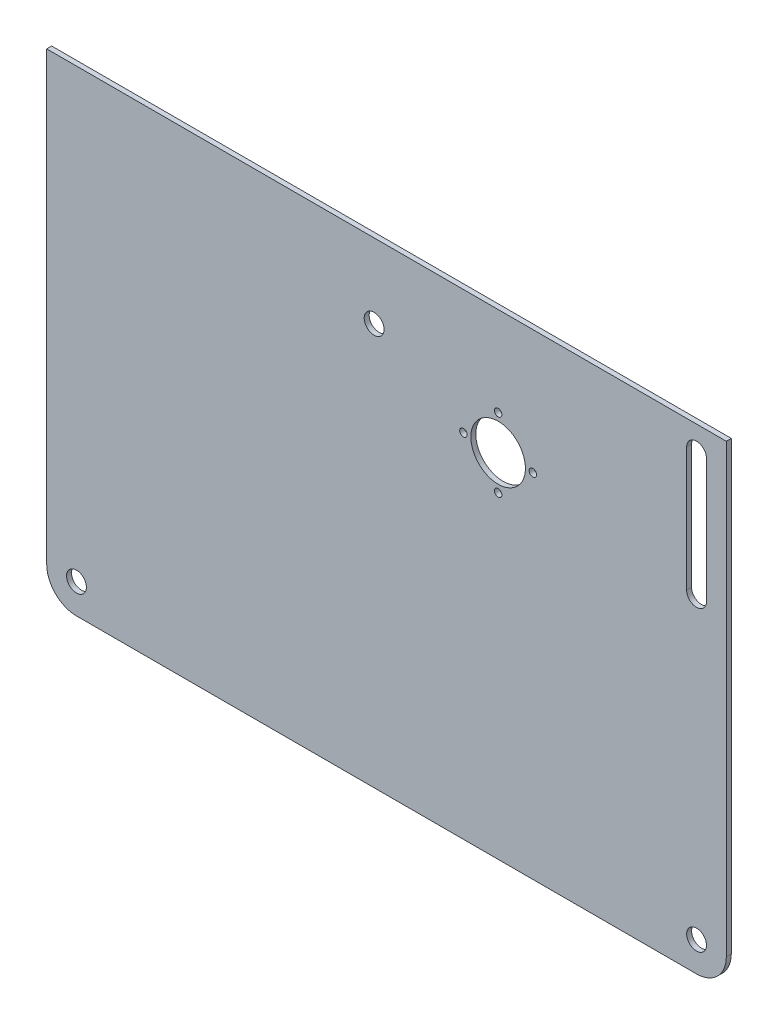
ISO-10303-21;
HEADER;
FILE_DESCRIPTION(('STEP AP214'),'2;1');
FILE_NAME('part.step','',(''),(''),'','','');
FILE_SCHEMA(('AUTOMOTIVE_DESIGN { 1 0 10303 214 1 1 1 1 }'));
ENDSEC;
DATA;
#1=APPLICATION_CONTEXT('core data for automotive mechanical design processes');
#2=APPLICATION_PROTOCOL_DEFINITION('international standard','automotive_design',2000,#1);
#3=PRODUCT_CONTEXT('',#1,'mechanical');
#4=PRODUCT('Part','Part','',(#3));
#5=PRODUCT_RELATED_PRODUCT_CATEGORY('part','',(#4));
#6=PRODUCT_DEFINITION_FORMATION('','',#4);
#7=PRODUCT_DEFINITION_CONTEXT('part definition',#1,'design');
#8=PRODUCT_DEFINITION('design','',#6,#7);
#9=PRODUCT_DEFINITION_SHAPE('','',#8);
#10=(LENGTH_UNIT() NAMED_UNIT(*) SI_UNIT(.MILLI.,.METRE.));
#11=(NAMED_UNIT(*) PLANE_ANGLE_UNIT() SI_UNIT($,.RADIAN.));
#12=(NAMED_UNIT(*) SI_UNIT($,.STERADIAN.) SOLID_ANGLE_UNIT());
#13=UNCERTAINTY_MEASURE_WITH_UNIT(LENGTH_MEASURE(1.E-05),#10,'distance_accuracy_value','');
#14=(GEOMETRIC_REPRESENTATION_CONTEXT(3) GLOBAL_UNCERTAINTY_ASSIGNED_CONTEXT((#13)) GLOBAL_UNIT_ASSIGNED_CONTEXT((#10,
#11,#12)) REPRESENTATION_CONTEXT('',''));
#15=CARTESIAN_POINT('',(0.,0.,0.));
#16=DIRECTION('',(0.,0.,1.));
#17=DIRECTION('',(1.,0.,0.));
#18=AXIS2_PLACEMENT_3D('',#15,#16,#17);
#19=CARTESIAN_POINT('',(0.,-12.,2.));
#20=DIRECTION('',(0.,1.,0.));
#21=DIRECTION('',(0.,0.,1.));
#22=AXIS2_PLACEMENT_3D('',#19,#20,#21);
#23=PLANE('',#22);
#24=DIRECTION('',(1.,0.,0.));
#25=VECTOR('',#24,1.);
#26=CARTESIAN_POINT('',(0.,-12.,0.));
#27=LINE('',#26,#25);
#28=CARTESIAN_POINT('',(-125.,-12.,0.));
#29=VERTEX_POINT('',#28);
#30=CARTESIAN_POINT('',(125.,-12.,0.));
#31=VERTEX_POINT('',#30);
#32=EDGE_CURVE('E189',#29,#31,#27,.T.);
#33=ORIENTED_EDGE('',*,*,#32,.T.);
#34=DIRECTION('',(0.,0.,-1.));
#35=VECTOR('',#34,1.);
#36=CARTESIAN_POINT('',(125.,-12.,2.));
#37=LINE('',#36,#35);
#38=CARTESIAN_POINT('',(125.,-12.,2.));
#39=VERTEX_POINT('',#38);
#40=EDGE_CURVE('E11',#39,#31,#37,.T.);
#41=ORIENTED_EDGE('',*,*,#40,.F.);
#42=DIRECTION('',(1.,0.,0.));
#43=VECTOR('',#42,1.);
#44=CARTESIAN_POINT('',(0.,-12.,2.));
#45=LINE('',#44,#43);
#46=CARTESIAN_POINT('',(-125.,-12.,2.));
#47=VERTEX_POINT('',#46);
#48=EDGE_CURVE('E307',#47,#39,#45,.T.);
#49=ORIENTED_EDGE('',*,*,#48,.F.);
#50=DIRECTION('',(0.,0.,-1.));
#51=VECTOR('',#50,1.);
#52=CARTESIAN_POINT('',(-125.,-12.,2.));
#53=LINE('',#52,#51);
#54=EDGE_CURVE('E58',#47,#29,#53,.T.);
#55=ORIENTED_EDGE('',*,*,#54,.T.);
#56=EDGE_LOOP('',(#33,#41,#49,#55));
#57=FACE_BOUND('',#56,.T.);
#58=ADVANCED_FACE('F39',(#57),#23,.F.);
#59=CARTESIAN_POINT('',(125.,0.,2.));
#60=DIRECTION('',(0.,0.,-1.));
#61=DIRECTION('',(-1.,0.,0.));
#62=AXIS2_PLACEMENT_3D('',#59,#60,#61);
#63=CYLINDRICAL_SURFACE('',#62,12.0000000000001);
#64=CARTESIAN_POINT('',(125.,0.,0.));
#65=DIRECTION('',(0.,0.,1.));
#66=DIRECTION('',(1.,0.,0.));
#67=AXIS2_PLACEMENT_3D('',#64,#65,#66);
#68=CIRCLE('',#67,12.0000000000001);
#69=CARTESIAN_POINT('',(137.,0.,0.));
#70=VERTEX_POINT('',#69);
#71=EDGE_CURVE('E191',#31,#70,#68,.T.);
#72=ORIENTED_EDGE('',*,*,#71,.T.);
#73=DIRECTION('',(0.,0.,-1.));
#74=VECTOR('',#73,1.);
#75=CARTESIAN_POINT('',(137.,0.,2.));
#76=LINE('',#75,#74);
#77=CARTESIAN_POINT('',(137.,0.,2.));
#78=VERTEX_POINT('',#77);
#79=EDGE_CURVE('E49',#78,#70,#76,.T.);
#80=ORIENTED_EDGE('',*,*,#79,.F.);
#81=CARTESIAN_POINT('',(125.,0.,2.));
#82=DIRECTION('',(0.,0.,1.));
#83=DIRECTION('',(1.,0.,0.));
#84=AXIS2_PLACEMENT_3D('',#81,#82,#83);
#85=CIRCLE('',#84,12.0000000000001);
#86=EDGE_CURVE('E309',#39,#78,#85,.T.);
#87=ORIENTED_EDGE('',*,*,#86,.F.);
#88=ORIENTED_EDGE('',*,*,#40,.T.);
#89=EDGE_LOOP('',(#72,#80,#87,#88));
#90=FACE_BOUND('',#89,.T.);
#91=ADVANCED_FACE('F242',(#90),#63,.T.);
#92=CARTESIAN_POINT('',(137.,0.,2.));
#93=DIRECTION('',(-1.,0.,0.));
#94=DIRECTION('',(0.,0.,1.));
#95=AXIS2_PLACEMENT_3D('',#92,#93,#94);
#96=PLANE('',#95);
#97=DIRECTION('',(0.,1.,0.));
#98=VECTOR('',#97,1.);
#99=CARTESIAN_POINT('',(137.,0.,0.));
#100=LINE('',#99,#98);
#101=CARTESIAN_POINT('',(137.,180.,0.));
#102=VERTEX_POINT('',#101);
#103=EDGE_CURVE('E193',#70,#102,#100,.T.);
#104=ORIENTED_EDGE('',*,*,#103,.T.);
#105=DIRECTION('',(0.,0.,-1.));
#106=VECTOR('',#105,1.);
#107=CARTESIAN_POINT('',(137.,180.,2.));
#108=LINE('',#107,#106);
#109=CARTESIAN_POINT('',(137.,180.,2.));
#110=VERTEX_POINT('',#109);
#111=EDGE_CURVE('E144',#110,#102,#108,.T.);
#112=ORIENTED_EDGE('',*,*,#111,.F.);
#113=DIRECTION('',(0.,1.,0.));
#114=VECTOR('',#113,1.);
#115=CARTESIAN_POINT('',(137.,0.,2.));
#116=LINE('',#115,#114);
#117=EDGE_CURVE('E132',#78,#110,#116,.T.);
#118=ORIENTED_EDGE('',*,*,#117,.F.);
#119=ORIENTED_EDGE('',*,*,#79,.T.);
#120=EDGE_LOOP('',(#104,#112,#118,#119));
#121=FACE_BOUND('',#120,.T.);
#122=ADVANCED_FACE('F247',(#121),#96,.F.);
#123=CARTESIAN_POINT('',(0.,180.,2.));
#124=DIRECTION('',(0.,-1.,0.));
#125=DIRECTION('',(1.,0.,0.));
#126=AXIS2_PLACEMENT_3D('',#123,#124,#125);
#127=PLANE('',#126);
#128=DIRECTION('',(-1.,0.,0.));
#129=VECTOR('',#128,1.);
#130=CARTESIAN_POINT('',(0.,180.,0.));
#131=LINE('',#130,#129);
#132=CARTESIAN_POINT('',(-137.,180.,0.));
#133=VERTEX_POINT('',#132);
#134=EDGE_CURVE('E141',#102,#133,#131,.T.);
#135=ORIENTED_EDGE('',*,*,#134,.T.);
#136=DIRECTION('',(0.,0.,-1.));
#137=VECTOR('',#136,1.);
#138=CARTESIAN_POINT('',(-137.,180.,2.));
#139=LINE('',#138,#137);
#140=CARTESIAN_POINT('',(-137.,180.,2.));
#141=VERTEX_POINT('',#140);
#142=EDGE_CURVE('E138',#141,#133,#139,.T.);
#143=ORIENTED_EDGE('',*,*,#142,.F.);
#144=DIRECTION('',(-1.,0.,0.));
#145=VECTOR('',#144,1.);
#146=CARTESIAN_POINT('',(0.,180.,2.));
#147=LINE('',#146,#145);
#148=EDGE_CURVE('E124',#110,#141,#147,.T.);
#149=ORIENTED_EDGE('',*,*,#148,.F.);
#150=ORIENTED_EDGE('',*,*,#111,.T.);
#151=EDGE_LOOP('',(#135,#143,#149,#150));
#152=FACE_BOUND('',#151,.T.);
#153=ADVANCED_FACE('F139',(#152),#127,.F.);
#154=CARTESIAN_POINT('',(-137.,0.,2.));
#155=DIRECTION('',(1.,0.,0.));
#156=DIRECTION('',(0.,1.,0.));
#157=AXIS2_PLACEMENT_3D('',#154,#155,#156);
#158=PLANE('',#157);
#159=DIRECTION('',(0.,-1.,0.));
#160=VECTOR('',#159,1.);
#161=CARTESIAN_POINT('',(-137.,0.,0.));
#162=LINE('',#161,#160);
#163=CARTESIAN_POINT('',(-137.,0.,0.));
#164=VERTEX_POINT('',#163);
#165=EDGE_CURVE('E196',#133,#164,#162,.T.);
#166=ORIENTED_EDGE('',*,*,#165,.T.);
#167=DIRECTION('',(0.,0.,-1.));
#168=VECTOR('',#167,1.);
#169=CARTESIAN_POINT('',(-137.,0.,2.));
#170=LINE('',#169,#168);
#171=CARTESIAN_POINT('',(-137.,0.,2.));
#172=VERTEX_POINT('',#171);
#173=EDGE_CURVE('E91',#172,#164,#170,.T.);
#174=ORIENTED_EDGE('',*,*,#173,.F.);
#175=DIRECTION('',(0.,-1.,0.));
#176=VECTOR('',#175,1.);
#177=CARTESIAN_POINT('',(-137.,0.,2.));
#178=LINE('',#177,#176);
#179=EDGE_CURVE('E130',#141,#172,#178,.T.);
#180=ORIENTED_EDGE('',*,*,#179,.F.);
#181=ORIENTED_EDGE('',*,*,#142,.T.);
#182=EDGE_LOOP('',(#166,#174,#180,#181));
#183=FACE_BOUND('',#182,.T.);
#184=ADVANCED_FACE('F146',(#183),#158,.F.);
#185=CARTESIAN_POINT('',(125.,120.,2.));
#186=DIRECTION('',(0.,0.,-1.));
#187=DIRECTION('',(-1.,0.,0.));
#188=AXIS2_PLACEMENT_3D('',#185,#186,#187);
#189=CYLINDRICAL_SURFACE('',#188,3.99999999999999);
#190=CARTESIAN_POINT('',(125.,120.,0.));
#191=DIRECTION('',(0.,0.,1.));
#192=DIRECTION('',(1.,0.,0.));
#193=AXIS2_PLACEMENT_3D('',#190,#191,#192);
#194=CIRCLE('',#193,3.99999999999999);
#195=CARTESIAN_POINT('',(121.,120.,0.));
#196=VERTEX_POINT('',#195);
#197=CARTESIAN_POINT('',(129.,120.,0.));
#198=VERTEX_POINT('',#197);
#199=EDGE_CURVE('E177',#196,#198,#194,.T.);
#200=ORIENTED_EDGE('',*,*,#199,.F.);
#201=DIRECTION('',(0.,0.,-1.));
#202=VECTOR('',#201,1.);
#203=CARTESIAN_POINT('',(121.,120.,2.));
#204=LINE('',#203,#202);
#205=CARTESIAN_POINT('',(121.,120.,2.));
#206=VERTEX_POINT('',#205);
#207=EDGE_CURVE('E43',#206,#196,#204,.T.);
#208=ORIENTED_EDGE('',*,*,#207,.F.);
#209=CARTESIAN_POINT('',(125.,120.,2.));
#210=DIRECTION('',(0.,0.,1.));
#211=DIRECTION('',(1.,0.,0.));
#212=AXIS2_PLACEMENT_3D('',#209,#210,#211);
#213=CIRCLE('',#212,3.99999999999999);
#214=CARTESIAN_POINT('',(129.,120.,2.));
#215=VERTEX_POINT('',#214);
#216=EDGE_CURVE('E224',#206,#215,#213,.T.);
#217=ORIENTED_EDGE('',*,*,#216,.T.);
#218=DIRECTION('',(0.,0.,-1.));
#219=VECTOR('',#218,1.);
#220=CARTESIAN_POINT('',(129.,120.,2.));
#221=LINE('',#220,#219);
#222=EDGE_CURVE('E149',#215,#198,#221,.T.);
#223=ORIENTED_EDGE('',*,*,#222,.T.);
#224=EDGE_LOOP('',(#200,#208,#217,#223));
#225=FACE_BOUND('',#224,.T.);
#226=ADVANCED_FACE('F223',(#225),#189,.F.);
#227=CARTESIAN_POINT('',(121.,0.,2.));
#228=DIRECTION('',(-1.,0.,0.));
#229=DIRECTION('',(0.,0.,1.));
#230=AXIS2_PLACEMENT_3D('',#227,#228,#229);
#231=PLANE('',#230);
#232=DIRECTION('',(0.,1.,0.));
#233=VECTOR('',#232,1.);
#234=CARTESIAN_POINT('',(121.,0.,0.));
#235=LINE('',#234,#233);
#236=CARTESIAN_POINT('',(121.,170.,0.));
#237=VERTEX_POINT('',#236);
#238=EDGE_CURVE('E180',#196,#237,#235,.T.);
#239=ORIENTED_EDGE('',*,*,#238,.T.);
#240=DIRECTION('',(0.,0.,-1.));
#241=VECTOR('',#240,1.);
#242=CARTESIAN_POINT('',(121.,170.,2.));
#243=LINE('',#242,#241);
#244=CARTESIAN_POINT('',(121.,170.,2.));
#245=VERTEX_POINT('',#244);
#246=EDGE_CURVE('E209',#245,#237,#243,.T.);
#247=ORIENTED_EDGE('',*,*,#246,.F.);
#248=DIRECTION('',(0.,1.,0.));
#249=VECTOR('',#248,1.);
#250=CARTESIAN_POINT('',(121.,0.,2.));
#251=LINE('',#250,#249);
#252=EDGE_CURVE('E217',#206,#245,#251,.T.);
#253=ORIENTED_EDGE('',*,*,#252,.F.);
#254=ORIENTED_EDGE('',*,*,#207,.T.);
#255=EDGE_LOOP('',(#239,#247,#253,#254));
#256=FACE_BOUND('',#255,.T.);
#257=ADVANCED_FACE('F216',(#256),#231,.F.);
#258=CARTESIAN_POINT('',(125.,170.,2.));
#259=DIRECTION('',(0.,0.,-1.));
#260=DIRECTION('',(-1.,0.,0.));
#261=AXIS2_PLACEMENT_3D('',#258,#259,#260);
#262=CYLINDRICAL_SURFACE('',#261,3.99999999999995);
#263=CARTESIAN_POINT('',(125.,170.,0.));
#264=DIRECTION('',(0.,0.,1.));
#265=DIRECTION('',(1.,0.,0.));
#266=AXIS2_PLACEMENT_3D('',#263,#264,#265);
#267=CIRCLE('',#266,3.99999999999995);
#268=CARTESIAN_POINT('',(129.,170.,0.));
#269=VERTEX_POINT('',#268);
#270=EDGE_CURVE('E183',#269,#237,#267,.T.);
#271=ORIENTED_EDGE('',*,*,#270,.F.);
#272=DIRECTION('',(0.,0.,-1.));
#273=VECTOR('',#272,1.);
#274=CARTESIAN_POINT('',(129.,170.,2.));
#275=LINE('',#274,#273);
#276=CARTESIAN_POINT('',(129.,170.,2.));
#277=VERTEX_POINT('',#276);
#278=EDGE_CURVE('E208',#277,#269,#275,.T.);
#279=ORIENTED_EDGE('',*,*,#278,.F.);
#280=CARTESIAN_POINT('',(125.,170.,2.));
#281=DIRECTION('',(0.,0.,1.));
#282=DIRECTION('',(1.,0.,0.));
#283=AXIS2_PLACEMENT_3D('',#280,#281,#282);
#284=CIRCLE('',#283,3.99999999999995);
#285=EDGE_CURVE('E300',#277,#245,#284,.T.);
#286=ORIENTED_EDGE('',*,*,#285,.T.);
#287=ORIENTED_EDGE('',*,*,#246,.T.);
#288=EDGE_LOOP('',(#271,#279,#286,#287));
#289=FACE_BOUND('',#288,.T.);
#290=ADVANCED_FACE('F231',(#289),#262,.F.);
#291=CARTESIAN_POINT('',(129.,0.,2.));
#292=DIRECTION('',(-1.,0.,0.));
#293=DIRECTION('',(0.,-1.,0.));
#294=AXIS2_PLACEMENT_3D('',#291,#292,#293);
#295=PLANE('',#294);
#296=DIRECTION('',(0.,1.,0.));
#297=VECTOR('',#296,1.);
#298=CARTESIAN_POINT('',(129.,0.,0.));
#299=LINE('',#298,#297);
#300=EDGE_CURVE('E186',#198,#269,#299,.T.);
#301=ORIENTED_EDGE('',*,*,#300,.F.);
#302=ORIENTED_EDGE('',*,*,#222,.F.);
#303=DIRECTION('',(0.,1.,0.));
#304=VECTOR('',#303,1.);
#305=CARTESIAN_POINT('',(129.,0.,2.));
#306=LINE('',#305,#304);
#307=EDGE_CURVE('E229',#215,#277,#306,.T.);
#308=ORIENTED_EDGE('',*,*,#307,.T.);
#309=ORIENTED_EDGE('',*,*,#278,.T.);
#310=EDGE_LOOP('',(#301,#302,#308,#309));
#311=FACE_BOUND('',#310,.T.);
#312=ADVANCED_FACE('F228',(#311),#295,.T.);
#313=CARTESIAN_POINT('',(-5.00000000000002,150.,2.));
#314=DIRECTION('',(0.,0.,-1.));
#315=DIRECTION('',(-1.,0.,0.));
#316=AXIS2_PLACEMENT_3D('',#313,#314,#315);
#317=CYLINDRICAL_SURFACE('',#316,4.00000000000001);
#318=CARTESIAN_POINT('',(-5.00000000000002,150.,2.));
#319=DIRECTION('',(0.,0.,1.));
#320=DIRECTION('',(1.,0.,0.));
#321=AXIS2_PLACEMENT_3D('',#318,#319,#320);
#322=CIRCLE('',#321,4.00000000000001);
#323=CARTESIAN_POINT('',(-1.00000000000001,150.,2.));
#324=VERTEX_POINT('',#323);
#325=EDGE_CURVE('E298',#324,#324,#322,.T.);
#326=ORIENTED_EDGE('',*,*,#325,.T.);
#327=EDGE_LOOP('',(#326));
#328=FACE_BOUND('',#327,.T.);
#329=CARTESIAN_POINT('',(-5.00000000000002,150.,0.));
#330=DIRECTION('',(0.,0.,1.));
#331=DIRECTION('',(1.,0.,0.));
#332=AXIS2_PLACEMENT_3D('',#329,#330,#331);
#333=CIRCLE('',#332,4.00000000000001);
#334=CARTESIAN_POINT('',(-1.00000000000001,150.,0.));
#335=VERTEX_POINT('',#334);
#336=EDGE_CURVE('E174',#335,#335,#333,.T.);
#337=ORIENTED_EDGE('',*,*,#336,.F.);
#338=EDGE_LOOP('',(#337));
#339=FACE_BOUND('',#338,.T.);
#340=ADVANCED_FACE('F238',(#328,#339),#317,.F.);
#341=CARTESIAN_POINT('',(45.,130.,2.));
#342=DIRECTION('',(0.,0.,-1.));
#343=DIRECTION('',(-1.,0.,0.));
#344=AXIS2_PLACEMENT_3D('',#341,#342,#343);
#345=CYLINDRICAL_SURFACE('',#344,11.);
#346=CARTESIAN_POINT('',(45.,130.,2.));
#347=DIRECTION('',(0.,0.,1.));
#348=DIRECTION('',(1.,0.,0.));
#349=AXIS2_PLACEMENT_3D('',#346,#347,#348);
#350=CIRCLE('',#349,11.);
#351=CARTESIAN_POINT('',(56.,130.,2.));
#352=VERTEX_POINT('',#351);
#353=EDGE_CURVE('E294',#352,#352,#350,.T.);
#354=ORIENTED_EDGE('',*,*,#353,.T.);
#355=EDGE_LOOP('',(#354));
#356=FACE_BOUND('',#355,.T.);
#357=CARTESIAN_POINT('',(45.,130.,0.));
#358=DIRECTION('',(0.,0.,1.));
#359=DIRECTION('',(1.,0.,0.));
#360=AXIS2_PLACEMENT_3D('',#357,#358,#359);
#361=CIRCLE('',#360,11.);
#362=CARTESIAN_POINT('',(56.,130.,0.));
#363=VERTEX_POINT('',#362);
#364=EDGE_CURVE('E171',#363,#363,#361,.T.);
#365=ORIENTED_EDGE('',*,*,#364,.F.);
#366=EDGE_LOOP('',(#365));
#367=FACE_BOUND('',#366,.T.);
#368=ADVANCED_FACE('F340',(#356,#367),#345,.F.);
#369=CARTESIAN_POINT('',(125.,0.,2.));
#370=DIRECTION('',(0.,0.,-1.));
#371=DIRECTION('',(-1.,0.,0.));
#372=AXIS2_PLACEMENT_3D('',#369,#370,#371);
#373=CYLINDRICAL_SURFACE('',#372,3.99999999999999);
#374=CARTESIAN_POINT('',(125.,0.,2.));
#375=DIRECTION('',(0.,0.,1.));
#376=DIRECTION('',(1.,0.,0.));
#377=AXIS2_PLACEMENT_3D('',#374,#375,#376);
#378=CIRCLE('',#377,3.99999999999999);
#379=CARTESIAN_POINT('',(129.,0.,2.));
#380=VERTEX_POINT('',#379);
#381=EDGE_CURVE('E290',#380,#380,#378,.T.);
#382=ORIENTED_EDGE('',*,*,#381,.T.);
#383=EDGE_LOOP('',(#382));
#384=FACE_BOUND('',#383,.T.);
#385=CARTESIAN_POINT('',(125.,0.,0.));
#386=DIRECTION('',(0.,0.,1.));
#387=DIRECTION('',(1.,0.,0.));
#388=AXIS2_PLACEMENT_3D('',#385,#386,#387);
#389=CIRCLE('',#388,3.99999999999999);
#390=CARTESIAN_POINT('',(129.,0.,0.));
#391=VERTEX_POINT('',#390);
#392=EDGE_CURVE('E168',#391,#391,#389,.T.);
#393=ORIENTED_EDGE('',*,*,#392,.F.);
#394=EDGE_LOOP('',(#393));
#395=FACE_BOUND('',#394,.T.);
#396=ADVANCED_FACE('F346',(#384,#395),#373,.F.);
#397=CARTESIAN_POINT('',(-125.,0.,2.));
#398=DIRECTION('',(0.,0.,-1.));
#399=DIRECTION('',(-1.,0.,0.));
#400=AXIS2_PLACEMENT_3D('',#397,#398,#399);
#401=CYLINDRICAL_SURFACE('',#400,4.00000000000001);
#402=CARTESIAN_POINT('',(-125.,0.,2.));
#403=DIRECTION('',(0.,0.,1.));
#404=DIRECTION('',(1.,0.,0.));
#405=AXIS2_PLACEMENT_3D('',#402,#403,#404);
#406=CIRCLE('',#405,4.00000000000001);
#407=CARTESIAN_POINT('',(-121.,0.,2.));
#408=VERTEX_POINT('',#407);
#409=EDGE_CURVE('E286',#408,#408,#406,.T.);
#410=ORIENTED_EDGE('',*,*,#409,.T.);
#411=EDGE_LOOP('',(#410));
#412=FACE_BOUND('',#411,.T.);
#413=CARTESIAN_POINT('',(-125.,0.,0.));
#414=DIRECTION('',(0.,0.,1.));
#415=DIRECTION('',(1.,0.,0.));
#416=AXIS2_PLACEMENT_3D('',#413,#414,#415);
#417=CIRCLE('',#416,4.00000000000001);
#418=CARTESIAN_POINT('',(-121.,0.,0.));
#419=VERTEX_POINT('',#418);
#420=EDGE_CURVE('E165',#419,#419,#417,.T.);
#421=ORIENTED_EDGE('',*,*,#420,.F.);
#422=EDGE_LOOP('',(#421));
#423=FACE_BOUND('',#422,.T.);
#424=ADVANCED_FACE('F353',(#412,#423),#401,.F.);
#425=CARTESIAN_POINT('',(45.,144.,2.));
#426=DIRECTION('',(0.,0.,-1.));
#427=DIRECTION('',(-1.,0.,0.));
#428=AXIS2_PLACEMENT_3D('',#425,#426,#427);
#429=CYLINDRICAL_SURFACE('',#428,1.5);
#430=CARTESIAN_POINT('',(45.,144.,2.));
#431=DIRECTION('',(0.,0.,1.));
#432=DIRECTION('',(1.,0.,0.));
#433=AXIS2_PLACEMENT_3D('',#430,#431,#432);
#434=CIRCLE('',#433,1.5);
#435=CARTESIAN_POINT('',(46.5,144.,2.));
#436=VERTEX_POINT('',#435);
#437=EDGE_CURVE('E282',#436,#436,#434,.T.);
#438=ORIENTED_EDGE('',*,*,#437,.T.);
#439=EDGE_LOOP('',(#438));
#440=FACE_BOUND('',#439,.T.);
#441=CARTESIAN_POINT('',(45.,144.,0.));
#442=DIRECTION('',(0.,0.,1.));
#443=DIRECTION('',(1.,0.,0.));
#444=AXIS2_PLACEMENT_3D('',#441,#442,#443);
#445=CIRCLE('',#444,1.5);
#446=CARTESIAN_POINT('',(46.5,144.,0.));
#447=VERTEX_POINT('',#446);
#448=EDGE_CURVE('E162',#447,#447,#445,.T.);
#449=ORIENTED_EDGE('',*,*,#448,.F.);
#450=EDGE_LOOP('',(#449));
#451=FACE_BOUND('',#450,.T.);
#452=ADVANCED_FACE('F357',(#440,#451),#429,.F.);
#453=CARTESIAN_POINT('',(59.,130.,2.));
#454=DIRECTION('',(0.,0.,-1.));
#455=DIRECTION('',(-1.,0.,0.));
#456=AXIS2_PLACEMENT_3D('',#453,#454,#455);
#457=CYLINDRICAL_SURFACE('',#456,1.49999999999999);
#458=CARTESIAN_POINT('',(59.,130.,2.));
#459=DIRECTION('',(0.,0.,1.));
#460=DIRECTION('',(1.,0.,0.));
#461=AXIS2_PLACEMENT_3D('',#458,#459,#460);
#462=CIRCLE('',#461,1.49999999999999);
#463=CARTESIAN_POINT('',(60.5,130.,2.));
#464=VERTEX_POINT('',#463);
#465=EDGE_CURVE('E278',#464,#464,#462,.T.);
#466=ORIENTED_EDGE('',*,*,#465,.T.);
#467=EDGE_LOOP('',(#466));
#468=FACE_BOUND('',#467,.T.);
#469=CARTESIAN_POINT('',(59.,130.,0.));
#470=DIRECTION('',(0.,0.,1.));
#471=DIRECTION('',(1.,0.,0.));
#472=AXIS2_PLACEMENT_3D('',#469,#470,#471);
#473=CIRCLE('',#472,1.49999999999999);
#474=CARTESIAN_POINT('',(60.5,130.,0.));
#475=VERTEX_POINT('',#474);
#476=EDGE_CURVE('E159',#475,#475,#473,.T.);
#477=ORIENTED_EDGE('',*,*,#476,.F.);
#478=EDGE_LOOP('',(#477));
#479=FACE_BOUND('',#478,.T.);
#480=ADVANCED_FACE('F361',(#468,#479),#457,.F.);
#481=CARTESIAN_POINT('',(45.,116.,2.));
#482=DIRECTION('',(0.,0.,-1.));
#483=DIRECTION('',(-1.,0.,0.));
#484=AXIS2_PLACEMENT_3D('',#481,#482,#483);
#485=CYLINDRICAL_SURFACE('',#484,1.50000000000001);
#486=CARTESIAN_POINT('',(45.,116.,2.));
#487=DIRECTION('',(0.,0.,1.));
#488=DIRECTION('',(1.,0.,0.));
#489=AXIS2_PLACEMENT_3D('',#486,#487,#488);
#490=CIRCLE('',#489,1.50000000000001);
#491=CARTESIAN_POINT('',(46.5,116.,2.));
#492=VERTEX_POINT('',#491);
#493=EDGE_CURVE('E274',#492,#492,#490,.T.);
#494=ORIENTED_EDGE('',*,*,#493,.T.);
#495=EDGE_LOOP('',(#494));
#496=FACE_BOUND('',#495,.T.);
#497=CARTESIAN_POINT('',(45.,116.,0.));
#498=DIRECTION('',(0.,0.,1.));
#499=DIRECTION('',(1.,0.,0.));
#500=AXIS2_PLACEMENT_3D('',#497,#498,#499);
#501=CIRCLE('',#500,1.50000000000001);
#502=CARTESIAN_POINT('',(46.5,116.,0.));
#503=VERTEX_POINT('',#502);
#504=EDGE_CURVE('E156',#503,#503,#501,.T.);
#505=ORIENTED_EDGE('',*,*,#504,.F.);
#506=EDGE_LOOP('',(#505));
#507=FACE_BOUND('',#506,.T.);
#508=ADVANCED_FACE('F322',(#496,#507),#485,.F.);
#509=CARTESIAN_POINT('',(31.,130.,2.));
#510=DIRECTION('',(0.,0.,-1.));
#511=DIRECTION('',(-1.,0.,0.));
#512=AXIS2_PLACEMENT_3D('',#509,#510,#511);
#513=CYLINDRICAL_SURFACE('',#512,1.5);
#514=CARTESIAN_POINT('',(31.,130.,2.));
#515=DIRECTION('',(0.,0.,1.));
#516=DIRECTION('',(1.,0.,0.));
#517=AXIS2_PLACEMENT_3D('',#514,#515,#516);
#518=CIRCLE('',#517,1.5);
#519=CARTESIAN_POINT('',(32.5,130.,2.));
#520=VERTEX_POINT('',#519);
#521=EDGE_CURVE('E201',#520,#520,#518,.T.);
#522=ORIENTED_EDGE('',*,*,#521,.T.);
#523=EDGE_LOOP('',(#522));
#524=FACE_BOUND('',#523,.T.);
#525=CARTESIAN_POINT('',(31.,130.,0.));
#526=DIRECTION('',(0.,0.,1.));
#527=DIRECTION('',(1.,0.,0.));
#528=AXIS2_PLACEMENT_3D('',#525,#526,#527);
#529=CIRCLE('',#528,1.5);
#530=CARTESIAN_POINT('',(32.5,130.,0.));
#531=VERTEX_POINT('',#530);
#532=EDGE_CURVE('E153',#531,#531,#529,.T.);
#533=ORIENTED_EDGE('',*,*,#532,.F.);
#534=EDGE_LOOP('',(#533));
#535=FACE_BOUND('',#534,.T.);
#536=ADVANCED_FACE('F41',(#524,#535),#513,.F.);
#537=CARTESIAN_POINT('',(-125.,0.,2.));
#538=DIRECTION('',(0.,0.,-1.));
#539=DIRECTION('',(-1.,0.,0.));
#540=AXIS2_PLACEMENT_3D('',#537,#538,#539);
#541=CYLINDRICAL_SURFACE('',#540,12.);
#542=CARTESIAN_POINT('',(-125.,0.,0.));
#543=DIRECTION('',(0.,0.,1.));
#544=DIRECTION('',(1.,0.,0.));
#545=AXIS2_PLACEMENT_3D('',#542,#543,#544);
#546=CIRCLE('',#545,12.);
#547=EDGE_CURVE('E198',#29,#164,#546,.F.);
#548=ORIENTED_EDGE('',*,*,#547,.F.);
#549=ORIENTED_EDGE('',*,*,#54,.F.);
#550=CARTESIAN_POINT('',(-125.,0.,2.));
#551=DIRECTION('',(0.,0.,1.));
#552=DIRECTION('',(1.,0.,0.));
#553=AXIS2_PLACEMENT_3D('',#550,#551,#552);
#554=CIRCLE('',#553,12.);
#555=EDGE_CURVE('E147',#47,#172,#554,.F.);
#556=ORIENTED_EDGE('',*,*,#555,.T.);
#557=ORIENTED_EDGE('',*,*,#173,.T.);
#558=EDGE_LOOP('',(#548,#549,#556,#557));
#559=FACE_BOUND('',#558,.T.);
#560=ADVANCED_FACE('F258',(#559),#541,.T.);
#561=CARTESIAN_POINT('',(0.,0.,2.));
#562=DIRECTION('',(0.,0.,1.));
#563=DIRECTION('',(1.,0.,0.));
#564=AXIS2_PLACEMENT_3D('',#561,#562,#563);
#565=PLANE('',#564);
#566=ORIENTED_EDGE('',*,*,#521,.F.);
#567=EDGE_LOOP('',(#566));
#568=FACE_BOUND('',#567,.T.);
#569=ORIENTED_EDGE('',*,*,#493,.F.);
#570=EDGE_LOOP('',(#569));
#571=FACE_BOUND('',#570,.T.);
#572=ORIENTED_EDGE('',*,*,#465,.F.);
#573=EDGE_LOOP('',(#572));
#574=FACE_BOUND('',#573,.T.);
#575=ORIENTED_EDGE('',*,*,#437,.F.);
#576=EDGE_LOOP('',(#575));
#577=FACE_BOUND('',#576,.T.);
#578=ORIENTED_EDGE('',*,*,#409,.F.);
#579=EDGE_LOOP('',(#578));
#580=FACE_BOUND('',#579,.T.);
#581=ORIENTED_EDGE('',*,*,#381,.F.);
#582=EDGE_LOOP('',(#581));
#583=FACE_BOUND('',#582,.T.);
#584=ORIENTED_EDGE('',*,*,#353,.F.);
#585=EDGE_LOOP('',(#584));
#586=FACE_BOUND('',#585,.T.);
#587=ORIENTED_EDGE('',*,*,#325,.F.);
#588=EDGE_LOOP('',(#587));
#589=FACE_BOUND('',#588,.T.);
#590=ORIENTED_EDGE('',*,*,#216,.F.);
#591=ORIENTED_EDGE('',*,*,#252,.T.);
#592=ORIENTED_EDGE('',*,*,#285,.F.);
#593=ORIENTED_EDGE('',*,*,#307,.F.);
#594=EDGE_LOOP('',(#590,#591,#592,#593));
#595=FACE_BOUND('',#594,.T.);
#596=ORIENTED_EDGE('',*,*,#48,.T.);
#597=ORIENTED_EDGE('',*,*,#86,.T.);
#598=ORIENTED_EDGE('',*,*,#117,.T.);
#599=ORIENTED_EDGE('',*,*,#148,.T.);
#600=ORIENTED_EDGE('',*,*,#179,.T.);
#601=ORIENTED_EDGE('',*,*,#555,.F.);
#602=EDGE_LOOP('',(#596,#597,#598,#599,#600,#601));
#603=FACE_BOUND('',#602,.T.);
#604=ADVANCED_FACE('F127',(#568,#571,#574,#577,#580,#583,#586,#589,#595,#603),#565,.T.);
#605=CARTESIAN_POINT('',(0.,0.,0.));
#606=DIRECTION('',(0.,0.,1.));
#607=DIRECTION('',(1.,0.,0.));
#608=AXIS2_PLACEMENT_3D('',#605,#606,#607);
#609=PLANE('',#608);
#610=ORIENTED_EDGE('',*,*,#532,.T.);
#611=EDGE_LOOP('',(#610));
#612=FACE_BOUND('',#611,.T.);
#613=ORIENTED_EDGE('',*,*,#504,.T.);
#614=EDGE_LOOP('',(#613));
#615=FACE_BOUND('',#614,.T.);
#616=ORIENTED_EDGE('',*,*,#476,.T.);
#617=EDGE_LOOP('',(#616));
#618=FACE_BOUND('',#617,.T.);
#619=ORIENTED_EDGE('',*,*,#448,.T.);
#620=EDGE_LOOP('',(#619));
#621=FACE_BOUND('',#620,.T.);
#622=ORIENTED_EDGE('',*,*,#420,.T.);
#623=EDGE_LOOP('',(#622));
#624=FACE_BOUND('',#623,.T.);
#625=ORIENTED_EDGE('',*,*,#392,.T.);
#626=EDGE_LOOP('',(#625));
#627=FACE_BOUND('',#626,.T.);
#628=ORIENTED_EDGE('',*,*,#364,.T.);
#629=EDGE_LOOP('',(#628));
#630=FACE_BOUND('',#629,.T.);
#631=ORIENTED_EDGE('',*,*,#336,.T.);
#632=EDGE_LOOP('',(#631));
#633=FACE_BOUND('',#632,.T.);
#634=ORIENTED_EDGE('',*,*,#199,.T.);
#635=ORIENTED_EDGE('',*,*,#300,.T.);
#636=ORIENTED_EDGE('',*,*,#270,.T.);
#637=ORIENTED_EDGE('',*,*,#238,.F.);
#638=EDGE_LOOP('',(#634,#635,#636,#637));
#639=FACE_BOUND('',#638,.T.);
#640=ORIENTED_EDGE('',*,*,#32,.F.);
#641=ORIENTED_EDGE('',*,*,#547,.T.);
#642=ORIENTED_EDGE('',*,*,#165,.F.);
#643=ORIENTED_EDGE('',*,*,#134,.F.);
#644=ORIENTED_EDGE('',*,*,#103,.F.);
#645=ORIENTED_EDGE('',*,*,#71,.F.);
#646=EDGE_LOOP('',(#640,#641,#642,#643,#644,#645));
#647=FACE_BOUND('',#646,.T.);
#648=ADVANCED_FACE('F220',(#612,#615,#618,#621,#624,#627,#630,#633,#639,#647),#609,.F.);
#649=CLOSED_SHELL('',(#58,#91,#122,#153,#184,#226,#257,#290,#312,#340,#368,#396,#424,#452,#480,
#508,#536,#560,#604,#648));
#650=MANIFOLD_SOLID_BREP('B2',#649);
#651=ADVANCED_BREP_SHAPE_REPRESENTATION('',(#18,#650),#14);
#652=SHAPE_DEFINITION_REPRESENTATION(#9,#651);
ENDSEC;
END-ISO-10303-21;
